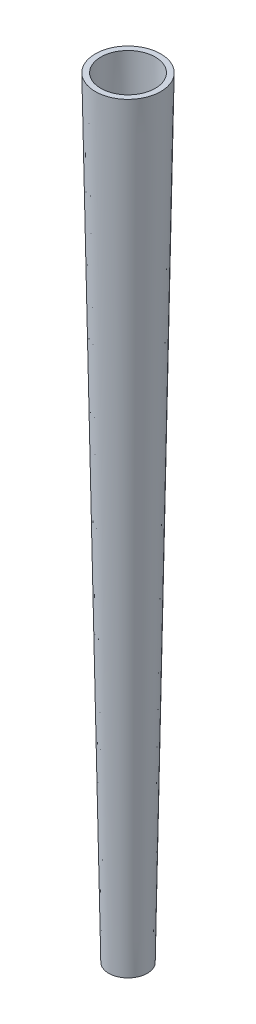
ISO-10303-21;
HEADER;
FILE_DESCRIPTION(('STEP AP214'),'2;1');
FILE_NAME('part.step','',(''),(''),'','','');
FILE_SCHEMA(('AUTOMOTIVE_DESIGN { 1 0 10303 214 1 1 1 1 }'));
ENDSEC;
DATA;
#1=APPLICATION_CONTEXT('core data for automotive mechanical design processes');
#2=APPLICATION_PROTOCOL_DEFINITION('international standard','automotive_design',2000,#1);
#3=PRODUCT_CONTEXT('',#1,'mechanical');
#4=PRODUCT('Part','Part','',(#3));
#5=PRODUCT_RELATED_PRODUCT_CATEGORY('part','',(#4));
#6=PRODUCT_DEFINITION_FORMATION('','',#4);
#7=PRODUCT_DEFINITION_CONTEXT('part definition',#1,'design');
#8=PRODUCT_DEFINITION('design','',#6,#7);
#9=PRODUCT_DEFINITION_SHAPE('','',#8);
#10=(LENGTH_UNIT() NAMED_UNIT(*) SI_UNIT(.MILLI.,.METRE.));
#11=(NAMED_UNIT(*) PLANE_ANGLE_UNIT() SI_UNIT($,.RADIAN.));
#12=(NAMED_UNIT(*) SI_UNIT($,.STERADIAN.) SOLID_ANGLE_UNIT());
#13=UNCERTAINTY_MEASURE_WITH_UNIT(LENGTH_MEASURE(1.E-05),#10,'distance_accuracy_value','');
#14=(GEOMETRIC_REPRESENTATION_CONTEXT(3) GLOBAL_UNCERTAINTY_ASSIGNED_CONTEXT((#13)) GLOBAL_UNIT_ASSIGNED_CONTEXT((#10,
#11,#12)) REPRESENTATION_CONTEXT('',''));
#15=CARTESIAN_POINT('',(0.,0.,0.));
#16=DIRECTION('',(0.,0.,1.));
#17=DIRECTION('',(1.,0.,0.));
#18=AXIS2_PLACEMENT_3D('',#15,#16,#17);
#19=CARTESIAN_POINT('',(0.,1.,0.));
#20=DIRECTION('',(0.,-1.,0.));
#21=DIRECTION('',(0.,0.,-1.));
#22=AXIS2_PLACEMENT_3D('',#19,#20,#21);
#23=PLANE('',#22);
#24=CARTESIAN_POINT('',(0.,1.,0.));
#25=DIRECTION('',(0.,-1.,0.));
#26=DIRECTION('',(0.,0.,-1.));
#27=AXIS2_PLACEMENT_3D('',#24,#25,#26);
#28=CIRCLE('',#27,2.51745506492913);
#29=CARTESIAN_POINT('',(0.,1.,-2.51745506492913));
#30=VERTEX_POINT('',#29);
#31=EDGE_CURVE('E10',#30,#30,#28,.T.);
#32=ORIENTED_EDGE('',*,*,#31,.F.);
#33=EDGE_LOOP('',(#32));
#34=FACE_BOUND('',#33,.T.);
#35=ADVANCED_FACE('F39',(#34),#23,.F.);
#36=CARTESIAN_POINT('',(0.,1.,0.));
#37=DIRECTION('',(0.,1.,0.));
#38=DIRECTION('',(0.,0.,1.));
#39=AXIS2_PLACEMENT_3D('',#36,#37,#38);
#40=CONICAL_SURFACE('',#39,2.51745506492913,0.0174532925199468);
#41=CARTESIAN_POINT('',(0.,140.,0.));
#42=DIRECTION('',(0.,-1.,0.));
#43=DIRECTION('',(0.,0.,-1.));
#44=AXIS2_PLACEMENT_3D('',#41,#42,#43);
#45=CIRCLE('',#44,4.94370908995187);
#46=CARTESIAN_POINT('',(0.,140.,-4.94370908995187));
#47=VERTEX_POINT('',#46);
#48=EDGE_CURVE('E44',#47,#47,#45,.T.);
#49=ORIENTED_EDGE('',*,*,#48,.F.);
#50=EDGE_LOOP('',(#49));
#51=FACE_BOUND('',#50,.T.);
#52=ORIENTED_EDGE('',*,*,#31,.T.);
#53=EDGE_LOOP('',(#52));
#54=FACE_BOUND('',#53,.T.);
#55=ADVANCED_FACE('F68',(#51,#54),#40,.F.);
#56=CARTESIAN_POINT('',(-5.94386141799579,140.,0.));
#57=DIRECTION('',(0.,-1.,0.));
#58=DIRECTION('',(0.,0.,-1.));
#59=AXIS2_PLACEMENT_3D('',#56,#57,#58);
#60=PLANE('',#59);
#61=CARTESIAN_POINT('',(0.,140.,0.));
#62=DIRECTION('',(0.,-1.,0.));
#63=DIRECTION('',(0.,0.,-1.));
#64=AXIS2_PLACEMENT_3D('',#61,#62,#63);
#65=CIRCLE('',#64,5.94386141799579);
#66=CARTESIAN_POINT('',(0.,140.,-5.94386141799579));
#67=VERTEX_POINT('',#66);
#68=EDGE_CURVE('E47',#67,#67,#65,.T.);
#69=ORIENTED_EDGE('',*,*,#68,.F.);
#70=EDGE_LOOP('',(#69));
#71=FACE_BOUND('',#70,.T.);
#72=ORIENTED_EDGE('',*,*,#48,.T.);
#73=EDGE_LOOP('',(#72));
#74=FACE_BOUND('',#73,.T.);
#75=ADVANCED_FACE('F61',(#71,#74),#60,.F.);
#76=CARTESIAN_POINT('',(0.,140.,0.));
#77=DIRECTION('',(0.,1.,0.));
#78=DIRECTION('',(0.,0.,1.));
#79=AXIS2_PLACEMENT_3D('',#76,#77,#78);
#80=CONICAL_SURFACE('',#79,5.94386141799579,0.017453292519947);
#81=CARTESIAN_POINT('',(0.,0.,0.));
#82=DIRECTION('',(0.,-1.,0.));
#83=DIRECTION('',(0.,0.,-1.));
#84=AXIS2_PLACEMENT_3D('',#81,#82,#83);
#85=CIRCLE('',#84,3.50015232804482);
#86=CARTESIAN_POINT('',(0.,0.,-3.50015232804482));
#87=VERTEX_POINT('',#86);
#88=EDGE_CURVE('E52',#87,#87,#85,.T.);
#89=ORIENTED_EDGE('',*,*,#88,.F.);
#90=EDGE_LOOP('',(#89));
#91=FACE_BOUND('',#90,.T.);
#92=ORIENTED_EDGE('',*,*,#68,.T.);
#93=EDGE_LOOP('',(#92));
#94=FACE_BOUND('',#93,.T.);
#95=ADVANCED_FACE('F62',(#91,#94),#80,.T.);
#96=CARTESIAN_POINT('',(-2.5,0.,0.));
#97=DIRECTION('',(0.,1.,0.));
#98=DIRECTION('',(0.,0.,1.));
#99=AXIS2_PLACEMENT_3D('',#96,#97,#98);
#100=PLANE('',#99);
#101=ORIENTED_EDGE('',*,*,#88,.T.);
#102=EDGE_LOOP('',(#101));
#103=FACE_BOUND('',#102,.T.);
#104=ADVANCED_FACE('F56',(#103),#100,.F.);
#105=CLOSED_SHELL('',(#35,#55,#75,#95,#104));
#106=MANIFOLD_SOLID_BREP('B2',#105);
#107=ADVANCED_BREP_SHAPE_REPRESENTATION('',(#18,#106),#14);
#108=SHAPE_DEFINITION_REPRESENTATION(#9,#107);
ENDSEC;
END-ISO-10303-21;
